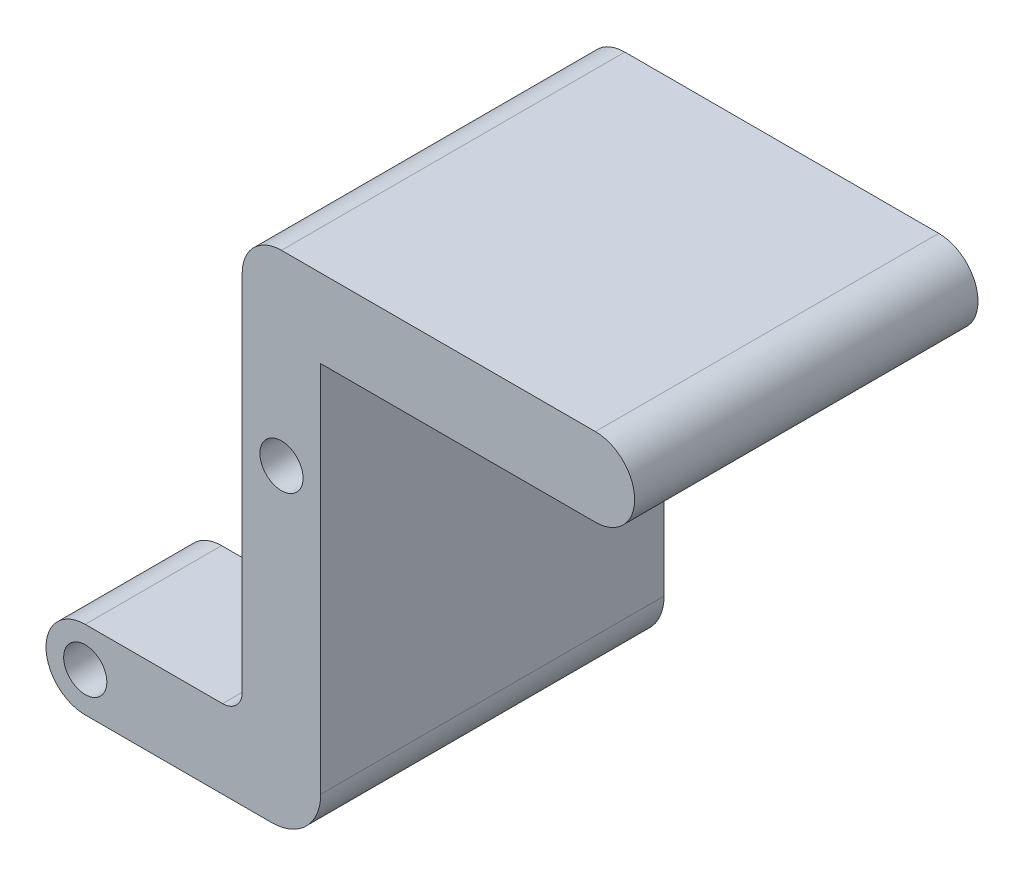
ISO-10303-21;
HEADER;
FILE_DESCRIPTION(('STEP AP214'),'2;1');
FILE_NAME('part.step','',(''),(''),'','','');
FILE_SCHEMA(('AUTOMOTIVE_DESIGN { 1 0 10303 214 1 1 1 1 }'));
ENDSEC;
DATA;
#1=APPLICATION_CONTEXT('core data for automotive mechanical design processes');
#2=APPLICATION_PROTOCOL_DEFINITION('international standard','automotive_design',2000,#1);
#3=PRODUCT_CONTEXT('',#1,'mechanical');
#4=PRODUCT('Part','Part','',(#3));
#5=PRODUCT_RELATED_PRODUCT_CATEGORY('part','',(#4));
#6=PRODUCT_DEFINITION_FORMATION('','',#4);
#7=PRODUCT_DEFINITION_CONTEXT('part definition',#1,'design');
#8=PRODUCT_DEFINITION('design','',#6,#7);
#9=PRODUCT_DEFINITION_SHAPE('','',#8);
#10=(LENGTH_UNIT() NAMED_UNIT(*) SI_UNIT(.MILLI.,.METRE.));
#11=(NAMED_UNIT(*) PLANE_ANGLE_UNIT() SI_UNIT($,.RADIAN.));
#12=(NAMED_UNIT(*) SI_UNIT($,.STERADIAN.) SOLID_ANGLE_UNIT());
#13=UNCERTAINTY_MEASURE_WITH_UNIT(LENGTH_MEASURE(1.E-05),#10,'distance_accuracy_value','');
#14=(GEOMETRIC_REPRESENTATION_CONTEXT(3) GLOBAL_UNCERTAINTY_ASSIGNED_CONTEXT((#13)) GLOBAL_UNIT_ASSIGNED_CONTEXT((#10,
#11,#12)) REPRESENTATION_CONTEXT('',''));
#15=CARTESIAN_POINT('',(0.,0.,0.));
#16=DIRECTION('',(0.,0.,1.));
#17=DIRECTION('',(1.,0.,0.));
#18=AXIS2_PLACEMENT_3D('',#15,#16,#17);
#19=CARTESIAN_POINT('',(-100.,0.,87.5));
#20=DIRECTION('',(0.,0.,-1.));
#21=DIRECTION('',(-1.,0.,0.));
#22=AXIS2_PLACEMENT_3D('',#19,#20,#21);
#23=CYLINDRICAL_SURFACE('',#22,20.);
#24=CARTESIAN_POINT('',(-100.,0.,-18.));
#25=DIRECTION('',(0.,0.,1.));
#26=DIRECTION('',(1.,0.,0.));
#27=AXIS2_PLACEMENT_3D('',#24,#25,#26);
#28=CIRCLE('',#27,20.);
#29=CARTESIAN_POINT('',(-100.,20.,-18.));
#30=VERTEX_POINT('',#29);
#31=CARTESIAN_POINT('',(-100.,-20.,-18.));
#32=VERTEX_POINT('',#31);
#33=EDGE_CURVE('E57',#30,#32,#28,.T.);
#34=ORIENTED_EDGE('',*,*,#33,.F.);
#35=DIRECTION('',(0.,0.,-1.));
#36=VECTOR('',#35,1.);
#37=CARTESIAN_POINT('',(-100.,20.,87.5));
#38=LINE('',#37,#36);
#39=CARTESIAN_POINT('',(-100.,20.,-87.5));
#40=VERTEX_POINT('',#39);
#41=EDGE_CURVE('E255',#30,#40,#38,.T.);
#42=ORIENTED_EDGE('',*,*,#41,.T.);
#43=CARTESIAN_POINT('',(-100.,0.,-87.5));
#44=DIRECTION('',(0.,0.,1.));
#45=DIRECTION('',(1.,0.,0.));
#46=AXIS2_PLACEMENT_3D('',#43,#44,#45);
#47=CIRCLE('',#46,20.);
#48=CARTESIAN_POINT('',(-100.,-20.,-87.5));
#49=VERTEX_POINT('',#48);
#50=EDGE_CURVE('E243',#40,#49,#47,.T.);
#51=ORIENTED_EDGE('',*,*,#50,.T.);
#52=DIRECTION('',(0.,0.,-1.));
#53=VECTOR('',#52,1.);
#54=CARTESIAN_POINT('',(-100.,-20.,87.5));
#55=LINE('',#54,#53);
#56=EDGE_CURVE('E240',#32,#49,#55,.T.);
#57=ORIENTED_EDGE('',*,*,#56,.F.);
#58=EDGE_LOOP('',(#34,#42,#51,#57));
#59=FACE_BOUND('',#58,.T.);
#60=ADVANCED_FACE('F40',(#59),#23,.T.);
#61=CARTESIAN_POINT('',(-100.,0.,-118.612698372208));
#62=DIRECTION('',(0.,0.,1.));
#63=DIRECTION('',(1.,0.,0.));
#64=AXIS2_PLACEMENT_3D('',#61,#62,#63);
#65=CYLINDRICAL_SURFACE('',#64,11.);
#66=CARTESIAN_POINT('',(-100.,0.,-87.5));
#67=DIRECTION('',(0.,0.,1.));
#68=DIRECTION('',(1.,0.,0.));
#69=AXIS2_PLACEMENT_3D('',#66,#67,#68);
#70=CIRCLE('',#69,11.);
#71=CARTESIAN_POINT('',(-89.,0.,-87.5));
#72=VERTEX_POINT('',#71);
#73=EDGE_CURVE('E220',#72,#72,#70,.F.);
#74=CARTESIAN_POINT('',(-100.,0.,-18.));
#75=DIRECTION('',(0.,0.,1.));
#76=DIRECTION('',(1.,0.,0.));
#77=AXIS2_PLACEMENT_3D('',#74,#75,#76);
#78=CIRCLE('',#77,11.);
#79=CARTESIAN_POINT('',(-89.,0.,-18.));
#80=VERTEX_POINT('',#79);
#81=EDGE_CURVE('E212',#80,#80,#78,.F.);
#82=CARTESIAN_POINT('',(-89.,0.,-87.5));
#83=CARTESIAN_POINT('',(-89.,0.,-86.7760416666667));
#84=CARTESIAN_POINT('',(-89.,0.,-86.0520833333333));
#85=CARTESIAN_POINT('',(-89.,0.,-84.6041666666667));
#86=CARTESIAN_POINT('',(-89.,0.,-83.8802083333333));
#87=CARTESIAN_POINT('',(-89.,0.,-82.4322916666667));
#88=CARTESIAN_POINT('',(-89.,0.,-81.7083333333333));
#89=CARTESIAN_POINT('',(-89.,0.,-80.2604166666667));
#90=CARTESIAN_POINT('',(-89.,0.,-79.5364583333333));
#91=CARTESIAN_POINT('',(-89.,0.,-78.0885416666667));
#92=CARTESIAN_POINT('',(-89.,0.,-77.3645833333333));
#93=CARTESIAN_POINT('',(-89.,0.,-75.9166666666667));
#94=CARTESIAN_POINT('',(-89.,0.,-75.1927083333333));
#95=CARTESIAN_POINT('',(-89.,0.,-73.7447916666667));
#96=CARTESIAN_POINT('',(-89.,0.,-73.0208333333333));
#97=CARTESIAN_POINT('',(-89.,0.,-71.5729166666667));
#98=CARTESIAN_POINT('',(-89.,0.,-70.8489583333333));
#99=CARTESIAN_POINT('',(-89.,0.,-69.4010416666667));
#100=CARTESIAN_POINT('',(-89.,0.,-68.6770833333333));
#101=CARTESIAN_POINT('',(-89.,0.,-67.2291666666667));
#102=CARTESIAN_POINT('',(-89.,0.,-66.5052083333333));
#103=CARTESIAN_POINT('',(-89.,0.,-65.0572916666667));
#104=CARTESIAN_POINT('',(-89.,0.,-64.3333333333333));
#105=CARTESIAN_POINT('',(-89.,0.,-62.8854166666667));
#106=CARTESIAN_POINT('',(-89.,0.,-62.1614583333333));
#107=CARTESIAN_POINT('',(-89.,0.,-60.7135416666667));
#108=CARTESIAN_POINT('',(-89.,0.,-59.9895833333333));
#109=CARTESIAN_POINT('',(-89.,0.,-58.5416666666667));
#110=CARTESIAN_POINT('',(-89.,0.,-57.8177083333333));
#111=CARTESIAN_POINT('',(-89.,0.,-56.3697916666667));
#112=CARTESIAN_POINT('',(-89.,0.,-55.6458333333333));
#113=CARTESIAN_POINT('',(-89.,0.,-54.1979166666667));
#114=CARTESIAN_POINT('',(-89.,0.,-53.4739583333333));
#115=CARTESIAN_POINT('',(-89.,0.,-52.0260416666667));
#116=CARTESIAN_POINT('',(-89.,0.,-51.3020833333333));
#117=CARTESIAN_POINT('',(-89.,0.,-49.8541666666667));
#118=CARTESIAN_POINT('',(-89.,0.,-49.1302083333333));
#119=CARTESIAN_POINT('',(-89.,0.,-47.6822916666667));
#120=CARTESIAN_POINT('',(-89.,0.,-46.9583333333333));
#121=CARTESIAN_POINT('',(-89.,0.,-45.5104166666667));
#122=CARTESIAN_POINT('',(-89.,0.,-44.7864583333333));
#123=CARTESIAN_POINT('',(-89.,0.,-43.3385416666667));
#124=CARTESIAN_POINT('',(-89.,0.,-42.6145833333333));
#125=CARTESIAN_POINT('',(-89.,0.,-41.1666666666667));
#126=CARTESIAN_POINT('',(-89.,0.,-40.4427083333333));
#127=CARTESIAN_POINT('',(-89.,0.,-38.9947916666667));
#128=CARTESIAN_POINT('',(-89.,0.,-38.2708333333333));
#129=CARTESIAN_POINT('',(-89.,0.,-36.8229166666667));
#130=CARTESIAN_POINT('',(-89.,0.,-36.0989583333333));
#131=CARTESIAN_POINT('',(-89.,0.,-34.6510416666667));
#132=CARTESIAN_POINT('',(-89.,0.,-33.9270833333333));
#133=CARTESIAN_POINT('',(-89.,0.,-32.4791666666667));
#134=CARTESIAN_POINT('',(-89.,0.,-31.7552083333333));
#135=CARTESIAN_POINT('',(-89.,0.,-30.3072916666667));
#136=CARTESIAN_POINT('',(-89.,0.,-29.5833333333333));
#137=CARTESIAN_POINT('',(-89.,0.,-28.1354166666667));
#138=CARTESIAN_POINT('',(-89.,0.,-27.4114583333333));
#139=CARTESIAN_POINT('',(-89.,0.,-25.9635416666667));
#140=CARTESIAN_POINT('',(-89.,0.,-25.2395833333333));
#141=CARTESIAN_POINT('',(-89.,0.,-23.7916666666667));
#142=CARTESIAN_POINT('',(-89.,0.,-23.0677083333333));
#143=CARTESIAN_POINT('',(-89.,0.,-21.6197916666667));
#144=CARTESIAN_POINT('',(-89.,0.,-20.8958333333333));
#145=CARTESIAN_POINT('',(-89.,0.,-19.4479166666667));
#146=CARTESIAN_POINT('',(-89.,0.,-18.7239583333333));
#147=CARTESIAN_POINT('',(-89.,0.,-18.));
#148=B_SPLINE_CURVE_WITH_KNOTS('',3,(#82,#83,#84,#85,#86,#87,#88,#89,#90,#91,#92,#93,#94,#95,
#96,#97,#98,#99,#100,#101,#102,#103,#104,#105,#106,#107,#108,#109,#110,#111,#112,#113,#114,#115,
#116,#117,#118,#119,#120,#121,#122,#123,#124,#125,#126,#127,#128,#129,#130,#131,#132,#133,#134,
#135,#136,#137,#138,#139,#140,#141,#142,#143,#144,#145,#146,#147),.UNSPECIFIED.,.F.,.F.,(4,2,2,
2,2,2,2,2,2,2,2,2,2,2,2,2,2,2,2,2,2,2,2,2,2,2,2,2,2,2,2,2,4),(0.,2.171875,4.34374999999999,
6.51562500000001,8.6875,10.859375,13.03125,15.203125,17.375,19.546875,21.71875,23.890625,
26.0625,28.234375,30.40625,32.578125,34.75,36.921875,39.09375,41.265625,43.4375,45.609375,
47.78125,49.953125,52.125,54.296875,56.46875,58.640625,60.8125,62.984375,65.15625,67.328125,
69.5),.UNSPECIFIED.);
#149=EDGE_CURVE('BSEAM278',#72,#80,#148,.T.);
#150=ORIENTED_EDGE('',*,*,#73,.T.);
#151=ORIENTED_EDGE('',*,*,#81,.F.);
#152=ORIENTED_EDGE('',*,*,#149,.T.);
#153=ORIENTED_EDGE('',*,*,#149,.F.);
#154=EDGE_LOOP('',(#150,#152,#151,#153));
#155=FACE_BOUND('',#154,.T.);
#156=ADVANCED_FACE('F278',(#155),#65,.F.);
#157=CARTESIAN_POINT('',(-20.,20.,87.5));
#158=DIRECTION('',(0.,-1.,0.));
#159=DIRECTION('',(1.,0.,0.));
#160=AXIS2_PLACEMENT_3D('',#157,#158,#159);
#161=PLANE('',#160);
#162=DIRECTION('',(0.,0.,-1.));
#163=VECTOR('',#162,1.);
#164=CARTESIAN_POINT('',(-80.,20.,18.));
#165=LINE('',#164,#163);
#166=CARTESIAN_POINT('',(-80.,20.,18.));
#167=VERTEX_POINT('',#166);
#168=CARTESIAN_POINT('',(-80.,20.,-18.));
#169=VERTEX_POINT('',#168);
#170=EDGE_CURVE('E207',#167,#169,#165,.T.);
#171=ORIENTED_EDGE('',*,*,#170,.F.);
#172=DIRECTION('',(-1.,0.,0.));
#173=VECTOR('',#172,1.);
#174=CARTESIAN_POINT('',(-120.,20.,18.));
#175=LINE('',#174,#173);
#176=CARTESIAN_POINT('',(-100.,20.,18.));
#177=VERTEX_POINT('',#176);
#178=EDGE_CURVE('E204',#167,#177,#175,.T.);
#179=ORIENTED_EDGE('',*,*,#178,.T.);
#180=CARTESIAN_POINT('',(-100.,20.,87.5));
#181=VERTEX_POINT('',#180);
#182=EDGE_CURVE('E256',#181,#177,#38,.T.);
#183=ORIENTED_EDGE('',*,*,#182,.F.);
#184=DIRECTION('',(-1.,0.,0.));
#185=VECTOR('',#184,1.);
#186=CARTESIAN_POINT('',(-20.,20.,87.5));
#187=LINE('',#186,#185);
#188=CARTESIAN_POINT('',(-30.,20.,87.5));
#189=VERTEX_POINT('',#188);
#190=EDGE_CURVE('E229',#189,#181,#187,.T.);
#191=ORIENTED_EDGE('',*,*,#190,.F.);
#192=DIRECTION('',(0.,0.,-1.));
#193=VECTOR('',#192,1.);
#194=CARTESIAN_POINT('',(-30.,20.,-87.5));
#195=LINE('',#194,#193);
#196=CARTESIAN_POINT('',(-30.,20.,-87.5));
#197=VERTEX_POINT('',#196);
#198=EDGE_CURVE('E259',#189,#197,#195,.T.);
#199=ORIENTED_EDGE('',*,*,#198,.T.);
#200=DIRECTION('',(-1.,0.,0.));
#201=VECTOR('',#200,1.);
#202=CARTESIAN_POINT('',(-20.,20.,-87.5));
#203=LINE('',#202,#201);
#204=EDGE_CURVE('E224',#197,#40,#203,.T.);
#205=ORIENTED_EDGE('',*,*,#204,.T.);
#206=ORIENTED_EDGE('',*,*,#41,.F.);
#207=DIRECTION('',(-1.,0.,0.));
#208=VECTOR('',#207,1.);
#209=CARTESIAN_POINT('',(-120.,20.,-18.));
#210=LINE('',#209,#208);
#211=EDGE_CURVE('E197',#169,#30,#210,.T.);
#212=ORIENTED_EDGE('',*,*,#211,.F.);
#213=EDGE_LOOP('',(#171,#179,#183,#191,#199,#205,#206,#212));
#214=FACE_BOUND('',#213,.T.);
#215=ADVANCED_FACE('F280',(#214),#161,.F.);
#216=ORIENTED_EDGE('',*,*,#182,.T.);
#217=CARTESIAN_POINT('',(-100.,0.,18.));
#218=DIRECTION('',(0.,0.,1.));
#219=DIRECTION('',(1.,0.,0.));
#220=AXIS2_PLACEMENT_3D('',#217,#218,#219);
#221=CIRCLE('',#220,20.);
#222=CARTESIAN_POINT('',(-100.,-20.,18.));
#223=VERTEX_POINT('',#222);
#224=EDGE_CURVE('E214',#177,#223,#221,.T.);
#225=ORIENTED_EDGE('',*,*,#224,.T.);
#226=CARTESIAN_POINT('',(-100.,-20.,87.5));
#227=VERTEX_POINT('',#226);
#228=EDGE_CURVE('E252',#227,#223,#55,.T.);
#229=ORIENTED_EDGE('',*,*,#228,.F.);
#230=CARTESIAN_POINT('',(-100.,0.,87.5));
#231=DIRECTION('',(0.,0.,1.));
#232=DIRECTION('',(1.,0.,0.));
#233=AXIS2_PLACEMENT_3D('',#230,#231,#232);
#234=CIRCLE('',#233,20.);
#235=EDGE_CURVE('E231',#181,#227,#234,.T.);
#236=ORIENTED_EDGE('',*,*,#235,.F.);
#237=EDGE_LOOP('',(#216,#225,#229,#236));
#238=FACE_BOUND('',#237,.T.);
#239=ADVANCED_FACE('F288',(#238),#23,.T.);
#240=CARTESIAN_POINT('',(20.,-20.,87.5));
#241=DIRECTION('',(0.,1.,0.));
#242=DIRECTION('',(-1.,0.,0.));
#243=AXIS2_PLACEMENT_3D('',#240,#241,#242);
#244=PLANE('',#243);
#245=ORIENTED_EDGE('',*,*,#228,.T.);
#246=DIRECTION('',(1.,0.,0.));
#247=VECTOR('',#246,1.);
#248=CARTESIAN_POINT('',(-120.,-20.,18.));
#249=LINE('',#248,#247);
#250=CARTESIAN_POINT('',(-80.,-20.,18.));
#251=VERTEX_POINT('',#250);
#252=EDGE_CURVE('E199',#223,#251,#249,.T.);
#253=ORIENTED_EDGE('',*,*,#252,.T.);
#254=DIRECTION('',(0.,0.,-1.));
#255=VECTOR('',#254,1.);
#256=CARTESIAN_POINT('',(-80.,-20.,18.));
#257=LINE('',#256,#255);
#258=CARTESIAN_POINT('',(-80.,-20.,-18.));
#259=VERTEX_POINT('',#258);
#260=EDGE_CURVE('E209',#251,#259,#257,.T.);
#261=ORIENTED_EDGE('',*,*,#260,.T.);
#262=DIRECTION('',(1.,0.,0.));
#263=VECTOR('',#262,1.);
#264=CARTESIAN_POINT('',(-120.,-20.,-18.));
#265=LINE('',#264,#263);
#266=EDGE_CURVE('E192',#32,#259,#265,.T.);
#267=ORIENTED_EDGE('',*,*,#266,.F.);
#268=ORIENTED_EDGE('',*,*,#56,.T.);
#269=DIRECTION('',(1.,0.,0.));
#270=VECTOR('',#269,1.);
#271=CARTESIAN_POINT('',(20.,-20.,-87.5));
#272=LINE('',#271,#270);
#273=CARTESIAN_POINT('',(-4.99999999999999,-20.,-87.5));
#274=VERTEX_POINT('',#273);
#275=EDGE_CURVE('E246',#49,#274,#272,.T.);
#276=ORIENTED_EDGE('',*,*,#275,.T.);
#277=DIRECTION('',(0.,0.,-1.));
#278=VECTOR('',#277,1.);
#279=CARTESIAN_POINT('',(-5.,-20.,87.5));
#280=LINE('',#279,#278);
#281=CARTESIAN_POINT('',(-4.99999999999999,-20.,87.5));
#282=VERTEX_POINT('',#281);
#283=EDGE_CURVE('E49',#274,#282,#280,.F.);
#284=ORIENTED_EDGE('',*,*,#283,.T.);
#285=DIRECTION('',(1.,0.,0.));
#286=VECTOR('',#285,1.);
#287=CARTESIAN_POINT('',(20.,-20.,87.5));
#288=LINE('',#287,#286);
#289=EDGE_CURVE('E234',#227,#282,#288,.T.);
#290=ORIENTED_EDGE('',*,*,#289,.F.);
#291=EDGE_LOOP('',(#245,#253,#261,#267,#268,#276,#284,#290));
#292=FACE_BOUND('',#291,.T.);
#293=ADVANCED_FACE('F329',(#292),#244,.F.);
#294=CARTESIAN_POINT('',(20.,-20.,87.5));
#295=DIRECTION('',(-1.,0.,0.));
#296=DIRECTION('',(0.,0.,1.));
#297=AXIS2_PLACEMENT_3D('',#294,#295,#296);
#298=PLANE('',#297);
#299=DIRECTION('',(0.,1.,0.));
#300=VECTOR('',#299,1.);
#301=CARTESIAN_POINT('',(20.,-20.,87.5));
#302=LINE('',#301,#300);
#303=CARTESIAN_POINT('',(20.,5.,87.5));
#304=VERTEX_POINT('',#303);
#305=CARTESIAN_POINT('',(20.,195.09,87.5));
#306=VERTEX_POINT('',#305);
#307=EDGE_CURVE('E155',#304,#306,#302,.T.);
#308=ORIENTED_EDGE('',*,*,#307,.F.);
#309=DIRECTION('',(0.,0.,-1.));
#310=VECTOR('',#309,1.);
#311=CARTESIAN_POINT('',(20.,5.,87.5));
#312=LINE('',#311,#310);
#313=CARTESIAN_POINT('',(20.,5.,-87.5));
#314=VERTEX_POINT('',#313);
#315=EDGE_CURVE('E268',#304,#314,#312,.T.);
#316=ORIENTED_EDGE('',*,*,#315,.T.);
#317=DIRECTION('',(0.,1.,0.));
#318=VECTOR('',#317,1.);
#319=CARTESIAN_POINT('',(20.,-20.,-87.5));
#320=LINE('',#319,#318);
#321=CARTESIAN_POINT('',(20.,195.09,-87.5));
#322=VERTEX_POINT('',#321);
#323=EDGE_CURVE('E248',#314,#322,#320,.T.);
#324=ORIENTED_EDGE('',*,*,#323,.T.);
#325=DIRECTION('',(0.,0.,-1.));
#326=VECTOR('',#325,1.);
#327=CARTESIAN_POINT('',(20.,195.09,308.954528289669));
#328=LINE('',#327,#326);
#329=EDGE_CURVE('E170',#306,#322,#328,.T.);
#330=ORIENTED_EDGE('',*,*,#329,.F.);
#331=EDGE_LOOP('',(#308,#316,#324,#330));
#332=FACE_BOUND('',#331,.T.);
#333=ADVANCED_FACE('F323',(#332),#298,.F.);
#334=CARTESIAN_POINT('',(-20.,20.,87.5));
#335=DIRECTION('',(1.,0.,0.));
#336=DIRECTION('',(0.,0.,-1.));
#337=AXIS2_PLACEMENT_3D('',#334,#335,#336);
#338=PLANE('',#337);
#339=DIRECTION('',(0.,-1.,0.));
#340=VECTOR('',#339,1.);
#341=CARTESIAN_POINT('',(-20.,20.,-87.5));
#342=LINE('',#341,#340);
#343=CARTESIAN_POINT('',(-20.,215.09,-87.5));
#344=VERTEX_POINT('',#343);
#345=CARTESIAN_POINT('',(-20.,30.,-87.5));
#346=VERTEX_POINT('',#345);
#347=EDGE_CURVE('E232',#344,#346,#342,.T.);
#348=ORIENTED_EDGE('',*,*,#347,.T.);
#349=DIRECTION('',(0.,0.,-1.));
#350=VECTOR('',#349,1.);
#351=CARTESIAN_POINT('',(-20.,30.,87.5));
#352=LINE('',#351,#350);
#353=CARTESIAN_POINT('',(-20.,30.,87.5));
#354=VERTEX_POINT('',#353);
#355=EDGE_CURVE('E262',#346,#354,#352,.F.);
#356=ORIENTED_EDGE('',*,*,#355,.T.);
#357=DIRECTION('',(0.,-1.,0.));
#358=VECTOR('',#357,1.);
#359=CARTESIAN_POINT('',(-20.,20.,87.5));
#360=LINE('',#359,#358);
#361=CARTESIAN_POINT('',(-20.,215.09,87.5));
#362=VERTEX_POINT('',#361);
#363=EDGE_CURVE('E237',#362,#354,#360,.T.);
#364=ORIENTED_EDGE('',*,*,#363,.F.);
#365=DIRECTION('',(0.,0.,-1.));
#366=VECTOR('',#365,1.);
#367=CARTESIAN_POINT('',(-20.,215.09,308.954528289669));
#368=LINE('',#367,#366);
#369=EDGE_CURVE('E187',#362,#344,#368,.T.);
#370=ORIENTED_EDGE('',*,*,#369,.T.);
#371=EDGE_LOOP('',(#348,#356,#364,#370));
#372=FACE_BOUND('',#371,.T.);
#373=ADVANCED_FACE('F313',(#372),#338,.F.);
#374=CARTESIAN_POINT('',(-100.,0.,87.5));
#375=DIRECTION('',(0.,0.,1.));
#376=DIRECTION('',(1.,0.,0.));
#377=AXIS2_PLACEMENT_3D('',#374,#375,#376);
#378=PLANE('',#377);
#379=CARTESIAN_POINT('',(-100.,0.,87.5));
#380=DIRECTION('',(0.,0.,1.));
#381=DIRECTION('',(1.,0.,0.));
#382=AXIS2_PLACEMENT_3D('',#379,#380,#381);
#383=CIRCLE('',#382,11.);
#384=CARTESIAN_POINT('',(-89.,0.,87.5));
#385=VERTEX_POINT('',#384);
#386=EDGE_CURVE('E217',#385,#385,#383,.T.);
#387=ORIENTED_EDGE('',*,*,#386,.F.);
#388=EDGE_LOOP('',(#387));
#389=FACE_BOUND('',#388,.T.);
#390=CARTESIAN_POINT('',(0.,140.,87.5));
#391=DIRECTION('',(0.,0.,1.));
#392=DIRECTION('',(1.,0.,0.));
#393=AXIS2_PLACEMENT_3D('',#390,#391,#392);
#394=CIRCLE('',#393,11.);
#395=CARTESIAN_POINT('',(11.,140.,87.5));
#396=VERTEX_POINT('',#395);
#397=EDGE_CURVE('E216',#396,#396,#394,.T.);
#398=ORIENTED_EDGE('',*,*,#397,.F.);
#399=EDGE_LOOP('',(#398));
#400=FACE_BOUND('',#399,.T.);
#401=ORIENTED_EDGE('',*,*,#289,.T.);
#402=CARTESIAN_POINT('',(-5.,5.,87.5));
#403=DIRECTION('',(0.,0.,1.));
#404=DIRECTION('',(1.,0.,0.));
#405=AXIS2_PLACEMENT_3D('',#402,#403,#404);
#406=CIRCLE('',#405,25.);
#407=EDGE_CURVE('E11',#282,#304,#406,.T.);
#408=ORIENTED_EDGE('',*,*,#407,.T.);
#409=ORIENTED_EDGE('',*,*,#307,.T.);
#410=DIRECTION('',(1.,0.,0.));
#411=VECTOR('',#410,1.);
#412=CARTESIAN_POINT('',(0.,195.09,87.5));
#413=LINE('',#412,#411);
#414=CARTESIAN_POINT('',(160.,195.09,87.5));
#415=VERTEX_POINT('',#414);
#416=EDGE_CURVE('E148',#306,#415,#413,.T.);
#417=ORIENTED_EDGE('',*,*,#416,.T.);
#418=CARTESIAN_POINT('',(160.,215.09,87.5));
#419=DIRECTION('',(0.,0.,1.));
#420=DIRECTION('',(1.,0.,0.));
#421=AXIS2_PLACEMENT_3D('',#418,#419,#420);
#422=CIRCLE('',#421,20.);
#423=CARTESIAN_POINT('',(160.,235.09,87.5));
#424=VERTEX_POINT('',#423);
#425=EDGE_CURVE('E152',#424,#415,#422,.F.);
#426=ORIENTED_EDGE('',*,*,#425,.F.);
#427=DIRECTION('',(1.,0.,0.));
#428=VECTOR('',#427,1.);
#429=CARTESIAN_POINT('',(0.,235.09,87.5));
#430=LINE('',#429,#428);
#431=CARTESIAN_POINT('',(0.,235.09,87.5));
#432=VERTEX_POINT('',#431);
#433=EDGE_CURVE('E180',#432,#424,#430,.T.);
#434=ORIENTED_EDGE('',*,*,#433,.F.);
#435=CARTESIAN_POINT('',(0.,215.09,87.5));
#436=DIRECTION('',(0.,0.,1.));
#437=DIRECTION('',(1.,0.,0.));
#438=AXIS2_PLACEMENT_3D('',#435,#436,#437);
#439=CIRCLE('',#438,20.);
#440=EDGE_CURVE('E160',#432,#362,#439,.T.);
#441=ORIENTED_EDGE('',*,*,#440,.T.);
#442=ORIENTED_EDGE('',*,*,#363,.T.);
#443=CARTESIAN_POINT('',(-30.,30.,87.5));
#444=DIRECTION('',(0.,0.,1.));
#445=DIRECTION('',(1.,0.,0.));
#446=AXIS2_PLACEMENT_3D('',#443,#444,#445);
#447=CIRCLE('',#446,10.);
#448=EDGE_CURVE('E266',#354,#189,#447,.F.);
#449=ORIENTED_EDGE('',*,*,#448,.T.);
#450=ORIENTED_EDGE('',*,*,#190,.T.);
#451=ORIENTED_EDGE('',*,*,#235,.T.);
#452=EDGE_LOOP('',(#401,#408,#409,#417,#426,#434,#441,#442,#449,#450,#451));
#453=FACE_BOUND('',#452,.T.);
#454=ADVANCED_FACE('F150',(#389,#400,#453),#378,.T.);
#455=CARTESIAN_POINT('',(-100.,0.,-87.5));
#456=DIRECTION('',(0.,0.,1.));
#457=DIRECTION('',(1.,0.,0.));
#458=AXIS2_PLACEMENT_3D('',#455,#456,#457);
#459=PLANE('',#458);
#460=ORIENTED_EDGE('',*,*,#73,.F.);
#461=EDGE_LOOP('',(#460));
#462=FACE_BOUND('',#461,.T.);
#463=CARTESIAN_POINT('',(0.,140.,-87.5));
#464=DIRECTION('',(0.,0.,1.));
#465=DIRECTION('',(1.,0.,0.));
#466=AXIS2_PLACEMENT_3D('',#463,#464,#465);
#467=CIRCLE('',#466,11.);
#468=CARTESIAN_POINT('',(11.,140.,-87.5));
#469=VERTEX_POINT('',#468);
#470=EDGE_CURVE('E221',#469,#469,#467,.F.);
#471=ORIENTED_EDGE('',*,*,#470,.F.);
#472=EDGE_LOOP('',(#471));
#473=FACE_BOUND('',#472,.T.);
#474=ORIENTED_EDGE('',*,*,#323,.F.);
#475=CARTESIAN_POINT('',(-5.,5.,-87.5));
#476=DIRECTION('',(0.,0.,1.));
#477=DIRECTION('',(1.,0.,0.));
#478=AXIS2_PLACEMENT_3D('',#475,#476,#477);
#479=CIRCLE('',#478,25.);
#480=EDGE_CURVE('E271',#314,#274,#479,.F.);
#481=ORIENTED_EDGE('',*,*,#480,.T.);
#482=ORIENTED_EDGE('',*,*,#275,.F.);
#483=ORIENTED_EDGE('',*,*,#50,.F.);
#484=ORIENTED_EDGE('',*,*,#204,.F.);
#485=CARTESIAN_POINT('',(-30.,30.,-87.5));
#486=DIRECTION('',(0.,0.,1.));
#487=DIRECTION('',(1.,0.,0.));
#488=AXIS2_PLACEMENT_3D('',#485,#486,#487);
#489=CIRCLE('',#488,10.);
#490=EDGE_CURVE('E264',#197,#346,#489,.T.);
#491=ORIENTED_EDGE('',*,*,#490,.T.);
#492=ORIENTED_EDGE('',*,*,#347,.F.);
#493=CARTESIAN_POINT('',(0.,215.09,-87.5));
#494=DIRECTION('',(0.,0.,-1.));
#495=DIRECTION('',(-1.,0.,0.));
#496=AXIS2_PLACEMENT_3D('',#493,#494,#495);
#497=CIRCLE('',#496,20.);
#498=CARTESIAN_POINT('',(0.,235.09,-87.5));
#499=VERTEX_POINT('',#498);
#500=EDGE_CURVE('E182',#499,#344,#497,.F.);
#501=ORIENTED_EDGE('',*,*,#500,.F.);
#502=DIRECTION('',(1.,0.,0.));
#503=VECTOR('',#502,1.);
#504=CARTESIAN_POINT('',(0.,235.09,-87.5));
#505=LINE('',#504,#503);
#506=CARTESIAN_POINT('',(160.,235.09,-87.5));
#507=VERTEX_POINT('',#506);
#508=EDGE_CURVE('E159',#499,#507,#505,.T.);
#509=ORIENTED_EDGE('',*,*,#508,.T.);
#510=CARTESIAN_POINT('',(160.,215.09,-87.5));
#511=DIRECTION('',(0.,0.,-1.));
#512=DIRECTION('',(-1.,0.,0.));
#513=AXIS2_PLACEMENT_3D('',#510,#511,#512);
#514=CIRCLE('',#513,20.);
#515=CARTESIAN_POINT('',(160.,195.09,-87.5));
#516=VERTEX_POINT('',#515);
#517=EDGE_CURVE('E175',#507,#516,#514,.T.);
#518=ORIENTED_EDGE('',*,*,#517,.T.);
#519=DIRECTION('',(1.,0.,0.));
#520=VECTOR('',#519,1.);
#521=CARTESIAN_POINT('',(0.,195.09,-87.5));
#522=LINE('',#521,#520);
#523=EDGE_CURVE('E166',#322,#516,#522,.T.);
#524=ORIENTED_EDGE('',*,*,#523,.F.);
#525=EDGE_LOOP('',(#474,#481,#482,#483,#484,#491,#492,#501,#509,#518,#524));
#526=FACE_BOUND('',#525,.T.);
#527=ADVANCED_FACE('F304',(#462,#473,#526),#459,.F.);
#528=CARTESIAN_POINT('',(0.,140.,-118.612698372208));
#529=DIRECTION('',(0.,0.,1.));
#530=DIRECTION('',(1.,0.,0.));
#531=AXIS2_PLACEMENT_3D('',#528,#529,#530);
#532=CYLINDRICAL_SURFACE('',#531,11.);
#533=CARTESIAN_POINT('',(11.,140.,-87.5));
#534=CARTESIAN_POINT('',(11.,140.,-85.6770833333333));
#535=CARTESIAN_POINT('',(11.,140.,-83.8541666666667));
#536=CARTESIAN_POINT('',(11.,140.,-80.2083333333333));
#537=CARTESIAN_POINT('',(11.,140.,-78.3854166666667));
#538=CARTESIAN_POINT('',(11.,140.,-74.7395833333333));
#539=CARTESIAN_POINT('',(11.,140.,-72.9166666666667));
#540=CARTESIAN_POINT('',(11.,140.,-69.2708333333334));
#541=CARTESIAN_POINT('',(11.,140.,-67.4479166666667));
#542=CARTESIAN_POINT('',(11.,140.,-63.8020833333333));
#543=CARTESIAN_POINT('',(11.,140.,-61.9791666666667));
#544=CARTESIAN_POINT('',(11.,140.,-58.3333333333333));
#545=CARTESIAN_POINT('',(11.,140.,-56.5104166666667));
#546=CARTESIAN_POINT('',(11.,140.,-52.8645833333333));
#547=CARTESIAN_POINT('',(11.,140.,-51.0416666666667));
#548=CARTESIAN_POINT('',(11.,140.,-47.3958333333333));
#549=CARTESIAN_POINT('',(11.,140.,-45.5729166666667));
#550=CARTESIAN_POINT('',(11.,140.,-41.9270833333334));
#551=CARTESIAN_POINT('',(11.,140.,-40.1041666666667));
#552=CARTESIAN_POINT('',(11.,140.,-36.4583333333333));
#553=CARTESIAN_POINT('',(11.,140.,-34.6354166666667));
#554=CARTESIAN_POINT('',(11.,140.,-30.9895833333333));
#555=CARTESIAN_POINT('',(11.,140.,-29.1666666666667));
#556=CARTESIAN_POINT('',(11.,140.,-25.5208333333333));
#557=CARTESIAN_POINT('',(11.,140.,-23.6979166666667));
#558=CARTESIAN_POINT('',(11.,140.,-20.0520833333334));
#559=CARTESIAN_POINT('',(11.,140.,-18.2291666666667));
#560=CARTESIAN_POINT('',(11.,140.,-14.5833333333334));
#561=CARTESIAN_POINT('',(11.,140.,-12.7604166666667));
#562=CARTESIAN_POINT('',(11.,140.,-9.11458333333336));
#563=CARTESIAN_POINT('',(11.,140.,-7.29166666666668));
#564=CARTESIAN_POINT('',(11.,140.,-3.64583333333334));
#565=CARTESIAN_POINT('',(11.,140.,-1.82291666666668));
#566=CARTESIAN_POINT('',(11.,140.,1.82291666666665));
#567=CARTESIAN_POINT('',(11.,140.,3.64583333333332));
#568=CARTESIAN_POINT('',(11.,140.,7.29166666666664));
#569=CARTESIAN_POINT('',(11.,140.,9.1145833333333));
#570=CARTESIAN_POINT('',(11.,140.,12.7604166666666));
#571=CARTESIAN_POINT('',(11.,140.,14.5833333333333));
#572=CARTESIAN_POINT('',(11.,140.,18.2291666666666));
#573=CARTESIAN_POINT('',(11.,140.,20.0520833333333));
#574=CARTESIAN_POINT('',(11.,140.,23.6979166666666));
#575=CARTESIAN_POINT('',(11.,140.,25.5208333333333));
#576=CARTESIAN_POINT('',(11.,140.,29.1666666666666));
#577=CARTESIAN_POINT('',(11.,140.,30.9895833333333));
#578=CARTESIAN_POINT('',(11.,140.,34.6354166666666));
#579=CARTESIAN_POINT('',(11.,140.,36.4583333333333));
#580=CARTESIAN_POINT('',(11.,140.,40.1041666666666));
#581=CARTESIAN_POINT('',(11.,140.,41.9270833333333));
#582=CARTESIAN_POINT('',(11.,140.,45.5729166666666));
#583=CARTESIAN_POINT('',(11.,140.,47.3958333333333));
#584=CARTESIAN_POINT('',(11.,140.,51.0416666666666));
#585=CARTESIAN_POINT('',(11.,140.,52.8645833333333));
#586=CARTESIAN_POINT('',(11.,140.,56.5104166666666));
#587=CARTESIAN_POINT('',(11.,140.,58.3333333333333));
#588=CARTESIAN_POINT('',(11.,140.,61.9791666666666));
#589=CARTESIAN_POINT('',(11.,140.,63.8020833333333));
#590=CARTESIAN_POINT('',(11.,140.,67.4479166666666));
#591=CARTESIAN_POINT('',(11.,140.,69.2708333333333));
#592=CARTESIAN_POINT('',(11.,140.,72.9166666666666));
#593=CARTESIAN_POINT('',(11.,140.,74.7395833333333));
#594=CARTESIAN_POINT('',(11.,140.,78.3854166666666));
#595=CARTESIAN_POINT('',(11.,140.,80.2083333333333));
#596=CARTESIAN_POINT('',(11.,140.,83.8541666666666));
#597=CARTESIAN_POINT('',(11.,140.,85.6770833333333));
#598=CARTESIAN_POINT('',(11.,140.,87.5));
#599=B_SPLINE_CURVE_WITH_KNOTS('',3,(#533,#534,#535,#536,#537,#538,#539,#540,#541,#542,#543,
#544,#545,#546,#547,#548,#549,#550,#551,#552,#553,#554,#555,#556,#557,#558,#559,#560,#561,#562,
#563,#564,#565,#566,#567,#568,#569,#570,#571,#572,#573,#574,#575,#576,#577,#578,#579,#580,#581,
#582,#583,#584,#585,#586,#587,#588,#589,#590,#591,#592,#593,#594,#595,#596,#597,#598),
.UNSPECIFIED.,.F.,.F.,(4,2,2,2,2,2,2,2,2,2,2,2,2,2,2,2,2,2,2,2,2,2,2,2,2,2,2,2,2,2,2,2,4),(0.,
5.46875000000001,10.9375,16.40625,21.875,27.34375,32.8125,38.28125,43.75,49.21875,54.6875,
60.15625,65.625,71.09375,76.5625,82.03125,87.5,92.96875,98.4375,103.90625,109.375,114.84375,
120.3125,125.78125,131.25,136.71875,142.1875,147.65625,153.125,158.59375,164.0625,169.53125,
175.),.UNSPECIFIED.);
#600=EDGE_CURVE('BSEAM297',#469,#396,#599,.T.);
#601=ORIENTED_EDGE('',*,*,#470,.T.);
#602=ORIENTED_EDGE('',*,*,#397,.T.);
#603=ORIENTED_EDGE('',*,*,#600,.T.);
#604=ORIENTED_EDGE('',*,*,#600,.F.);
#605=EDGE_LOOP('',(#601,#603,#602,#604));
#606=FACE_BOUND('',#605,.T.);
#607=ADVANCED_FACE('F297',(#606),#532,.F.);
#608=CARTESIAN_POINT('',(-100.,0.,18.));
#609=DIRECTION('',(0.,0.,1.));
#610=DIRECTION('',(1.,0.,0.));
#611=AXIS2_PLACEMENT_3D('',#608,#609,#610);
#612=CIRCLE('',#611,11.);
#613=CARTESIAN_POINT('',(-89.,0.,18.));
#614=VERTEX_POINT('',#613);
#615=EDGE_CURVE('E44',#614,#614,#612,.F.);
#616=CARTESIAN_POINT('',(-89.,0.,18.));
#617=CARTESIAN_POINT('',(-89.,0.,18.7239583333333));
#618=CARTESIAN_POINT('',(-89.,0.,19.4479166666666));
#619=CARTESIAN_POINT('',(-89.,0.,20.8958333333333));
#620=CARTESIAN_POINT('',(-89.,0.,21.6197916666666));
#621=CARTESIAN_POINT('',(-89.,0.,23.0677083333333));
#622=CARTESIAN_POINT('',(-89.,0.,23.7916666666666));
#623=CARTESIAN_POINT('',(-89.,0.,25.2395833333333));
#624=CARTESIAN_POINT('',(-89.,0.,25.9635416666666));
#625=CARTESIAN_POINT('',(-89.,0.,27.4114583333333));
#626=CARTESIAN_POINT('',(-89.,0.,28.1354166666666));
#627=CARTESIAN_POINT('',(-89.,0.,29.5833333333333));
#628=CARTESIAN_POINT('',(-89.,0.,30.3072916666666));
#629=CARTESIAN_POINT('',(-89.,0.,31.7552083333333));
#630=CARTESIAN_POINT('',(-89.,0.,32.4791666666666));
#631=CARTESIAN_POINT('',(-89.,0.,33.9270833333333));
#632=CARTESIAN_POINT('',(-89.,0.,34.6510416666666));
#633=CARTESIAN_POINT('',(-89.,0.,36.0989583333333));
#634=CARTESIAN_POINT('',(-89.,0.,36.8229166666666));
#635=CARTESIAN_POINT('',(-89.,0.,38.2708333333333));
#636=CARTESIAN_POINT('',(-89.,0.,38.9947916666666));
#637=CARTESIAN_POINT('',(-89.,0.,40.4427083333333));
#638=CARTESIAN_POINT('',(-89.,0.,41.1666666666666));
#639=CARTESIAN_POINT('',(-89.,0.,42.6145833333333));
#640=CARTESIAN_POINT('',(-89.,0.,43.3385416666666));
#641=CARTESIAN_POINT('',(-89.,0.,44.7864583333333));
#642=CARTESIAN_POINT('',(-89.,0.,45.5104166666666));
#643=CARTESIAN_POINT('',(-89.,0.,46.9583333333333));
#644=CARTESIAN_POINT('',(-89.,0.,47.6822916666666));
#645=CARTESIAN_POINT('',(-89.,0.,49.1302083333333));
#646=CARTESIAN_POINT('',(-89.,0.,49.8541666666666));
#647=CARTESIAN_POINT('',(-89.,0.,51.3020833333333));
#648=CARTESIAN_POINT('',(-89.,0.,52.0260416666666));
#649=CARTESIAN_POINT('',(-89.,0.,53.4739583333333));
#650=CARTESIAN_POINT('',(-89.,0.,54.1979166666666));
#651=CARTESIAN_POINT('',(-89.,0.,55.6458333333333));
#652=CARTESIAN_POINT('',(-89.,0.,56.3697916666666));
#653=CARTESIAN_POINT('',(-89.,0.,57.8177083333333));
#654=CARTESIAN_POINT('',(-89.,0.,58.5416666666666));
#655=CARTESIAN_POINT('',(-89.,0.,59.9895833333333));
#656=CARTESIAN_POINT('',(-89.,0.,60.7135416666666));
#657=CARTESIAN_POINT('',(-89.,0.,62.1614583333333));
#658=CARTESIAN_POINT('',(-89.,0.,62.8854166666666));
#659=CARTESIAN_POINT('',(-89.,0.,64.3333333333333));
#660=CARTESIAN_POINT('',(-89.,0.,65.0572916666666));
#661=CARTESIAN_POINT('',(-89.,0.,66.5052083333333));
#662=CARTESIAN_POINT('',(-89.,0.,67.2291666666666));
#663=CARTESIAN_POINT('',(-89.,0.,68.6770833333333));
#664=CARTESIAN_POINT('',(-89.,0.,69.4010416666666));
#665=CARTESIAN_POINT('',(-89.,0.,70.8489583333333));
#666=CARTESIAN_POINT('',(-89.,0.,71.5729166666666));
#667=CARTESIAN_POINT('',(-89.,0.,73.0208333333333));
#668=CARTESIAN_POINT('',(-89.,0.,73.7447916666666));
#669=CARTESIAN_POINT('',(-89.,0.,75.1927083333333));
#670=CARTESIAN_POINT('',(-89.,0.,75.9166666666666));
#671=CARTESIAN_POINT('',(-89.,0.,77.3645833333333));
#672=CARTESIAN_POINT('',(-89.,0.,78.0885416666666));
#673=CARTESIAN_POINT('',(-89.,0.,79.5364583333333));
#674=CARTESIAN_POINT('',(-89.,0.,80.2604166666666));
#675=CARTESIAN_POINT('',(-89.,0.,81.7083333333333));
#676=CARTESIAN_POINT('',(-89.,0.,82.4322916666666));
#677=CARTESIAN_POINT('',(-89.,0.,83.8802083333333));
#678=CARTESIAN_POINT('',(-89.,0.,84.6041666666666));
#679=CARTESIAN_POINT('',(-89.,0.,86.0520833333333));
#680=CARTESIAN_POINT('',(-89.,0.,86.7760416666666));
#681=CARTESIAN_POINT('',(-89.,0.,87.5));
#682=B_SPLINE_CURVE_WITH_KNOTS('',3,(#616,#617,#618,#619,#620,#621,#622,#623,#624,#625,#626,
#627,#628,#629,#630,#631,#632,#633,#634,#635,#636,#637,#638,#639,#640,#641,#642,#643,#644,#645,
#646,#647,#648,#649,#650,#651,#652,#653,#654,#655,#656,#657,#658,#659,#660,#661,#662,#663,#664,
#665,#666,#667,#668,#669,#670,#671,#672,#673,#674,#675,#676,#677,#678,#679,#680,#681),
.UNSPECIFIED.,.F.,.F.,(4,2,2,2,2,2,2,2,2,2,2,2,2,2,2,2,2,2,2,2,2,2,2,2,2,2,2,2,2,2,2,2,4),(0.,
2.17187499999999,4.34375000000001,6.515625,8.68750000000001,10.859375,13.03125,15.203125,17.375,
19.546875,21.71875,23.890625,26.0625,28.234375,30.40625,32.578125,34.75,36.921875,39.09375,
41.265625,43.4375,45.609375,47.78125,49.953125,52.125,54.296875,56.46875,58.640625,60.8125,
62.984375,65.15625,67.328125,69.5),.UNSPECIFIED.);
#683=EDGE_CURVE('BSEAM283',#614,#385,#682,.T.);
#684=ORIENTED_EDGE('',*,*,#615,.T.);
#685=ORIENTED_EDGE('',*,*,#386,.T.);
#686=ORIENTED_EDGE('',*,*,#683,.T.);
#687=ORIENTED_EDGE('',*,*,#683,.F.);
#688=EDGE_LOOP('',(#684,#686,#685,#687));
#689=FACE_BOUND('',#688,.T.);
#690=ADVANCED_FACE('F283',(#689),#65,.F.);
#691=CARTESIAN_POINT('',(-30.,30.,87.5));
#692=DIRECTION('',(0.,0.,1.));
#693=DIRECTION('',(1.,0.,0.));
#694=AXIS2_PLACEMENT_3D('',#691,#692,#693);
#695=CYLINDRICAL_SURFACE('',#694,10.);
#696=ORIENTED_EDGE('',*,*,#448,.F.);
#697=ORIENTED_EDGE('',*,*,#355,.F.);
#698=ORIENTED_EDGE('',*,*,#490,.F.);
#699=ORIENTED_EDGE('',*,*,#198,.F.);
#700=EDGE_LOOP('',(#696,#697,#698,#699));
#701=FACE_BOUND('',#700,.T.);
#702=ADVANCED_FACE('F296',(#701),#695,.F.);
#703=CARTESIAN_POINT('',(-5.,5.,87.5));
#704=DIRECTION('',(0.,0.,-1.));
#705=DIRECTION('',(-1.,0.,0.));
#706=AXIS2_PLACEMENT_3D('',#703,#704,#705);
#707=CYLINDRICAL_SURFACE('',#706,25.);
#708=ORIENTED_EDGE('',*,*,#407,.F.);
#709=ORIENTED_EDGE('',*,*,#283,.F.);
#710=ORIENTED_EDGE('',*,*,#480,.F.);
#711=ORIENTED_EDGE('',*,*,#315,.F.);
#712=EDGE_LOOP('',(#708,#709,#710,#711));
#713=FACE_BOUND('',#712,.T.);
#714=ADVANCED_FACE('F42',(#713),#707,.T.);
#715=CARTESIAN_POINT('',(0.,0.,18.));
#716=DIRECTION('',(0.,0.,1.));
#717=DIRECTION('',(1.,0.,0.));
#718=AXIS2_PLACEMENT_3D('',#715,#716,#717);
#719=PLANE('',#718);
#720=ORIENTED_EDGE('',*,*,#615,.F.);
#721=EDGE_LOOP('',(#720));
#722=FACE_BOUND('',#721,.T.);
#723=ORIENTED_EDGE('',*,*,#178,.F.);
#724=DIRECTION('',(0.,1.,0.));
#725=VECTOR('',#724,1.);
#726=CARTESIAN_POINT('',(-80.,20.,18.));
#727=LINE('',#726,#725);
#728=EDGE_CURVE('E202',#251,#167,#727,.T.);
#729=ORIENTED_EDGE('',*,*,#728,.F.);
#730=ORIENTED_EDGE('',*,*,#252,.F.);
#731=ORIENTED_EDGE('',*,*,#224,.F.);
#732=EDGE_LOOP('',(#723,#729,#730,#731));
#733=FACE_BOUND('',#732,.T.);
#734=ADVANCED_FACE('F347',(#722,#733),#719,.F.);
#735=CARTESIAN_POINT('',(0.,0.,-18.));
#736=DIRECTION('',(0.,0.,1.));
#737=DIRECTION('',(1.,0.,0.));
#738=AXIS2_PLACEMENT_3D('',#735,#736,#737);
#739=PLANE('',#738);
#740=ORIENTED_EDGE('',*,*,#81,.T.);
#741=EDGE_LOOP('',(#740));
#742=FACE_BOUND('',#741,.T.);
#743=ORIENTED_EDGE('',*,*,#33,.T.);
#744=ORIENTED_EDGE('',*,*,#266,.T.);
#745=DIRECTION('',(0.,1.,0.));
#746=VECTOR('',#745,1.);
#747=CARTESIAN_POINT('',(-80.,20.,-18.));
#748=LINE('',#747,#746);
#749=EDGE_CURVE('E194',#259,#169,#748,.T.);
#750=ORIENTED_EDGE('',*,*,#749,.T.);
#751=ORIENTED_EDGE('',*,*,#211,.T.);
#752=EDGE_LOOP('',(#743,#744,#750,#751));
#753=FACE_BOUND('',#752,.T.);
#754=ADVANCED_FACE('F276',(#742,#753),#739,.T.);
#755=CARTESIAN_POINT('',(-80.,20.,18.));
#756=DIRECTION('',(-1.,0.,0.));
#757=DIRECTION('',(0.,-1.,0.));
#758=AXIS2_PLACEMENT_3D('',#755,#756,#757);
#759=PLANE('',#758);
#760=ORIENTED_EDGE('',*,*,#260,.F.);
#761=ORIENTED_EDGE('',*,*,#728,.T.);
#762=ORIENTED_EDGE('',*,*,#170,.T.);
#763=ORIENTED_EDGE('',*,*,#749,.F.);
#764=EDGE_LOOP('',(#760,#761,#762,#763));
#765=FACE_BOUND('',#764,.T.);
#766=ADVANCED_FACE('F375',(#765),#759,.T.);
#767=CARTESIAN_POINT('',(160.,215.09,308.954528289669));
#768=DIRECTION('',(0.,0.,-1.));
#769=DIRECTION('',(-1.,0.,0.));
#770=AXIS2_PLACEMENT_3D('',#767,#768,#769);
#771=CYLINDRICAL_SURFACE('',#770,20.);
#772=DIRECTION('',(0.,0.,-1.));
#773=VECTOR('',#772,1.);
#774=CARTESIAN_POINT('',(160.,235.09,308.954528289669));
#775=LINE('',#774,#773);
#776=EDGE_CURVE('E174',#424,#507,#775,.T.);
#777=ORIENTED_EDGE('',*,*,#776,.F.);
#778=ORIENTED_EDGE('',*,*,#425,.T.);
#779=DIRECTION('',(0.,0.,-1.));
#780=VECTOR('',#779,1.);
#781=CARTESIAN_POINT('',(160.,195.09,308.954528289669));
#782=LINE('',#781,#780);
#783=EDGE_CURVE('E163',#415,#516,#782,.T.);
#784=ORIENTED_EDGE('',*,*,#783,.T.);
#785=ORIENTED_EDGE('',*,*,#517,.F.);
#786=EDGE_LOOP('',(#777,#778,#784,#785));
#787=FACE_BOUND('',#786,.T.);
#788=ADVANCED_FACE('F173',(#787),#771,.T.);
#789=CARTESIAN_POINT('',(0.,195.09,308.954528289669));
#790=DIRECTION('',(0.,1.,0.));
#791=DIRECTION('',(-1.,0.,0.));
#792=AXIS2_PLACEMENT_3D('',#789,#790,#791);
#793=PLANE('',#792);
#794=ORIENTED_EDGE('',*,*,#416,.F.);
#795=ORIENTED_EDGE('',*,*,#329,.T.);
#796=ORIENTED_EDGE('',*,*,#523,.T.);
#797=ORIENTED_EDGE('',*,*,#783,.F.);
#798=EDGE_LOOP('',(#794,#795,#796,#797));
#799=FACE_BOUND('',#798,.T.);
#800=ADVANCED_FACE('F164',(#799),#793,.F.);
#801=CARTESIAN_POINT('',(0.,215.09,308.954528289669));
#802=DIRECTION('',(0.,0.,-1.));
#803=DIRECTION('',(-1.,0.,0.));
#804=AXIS2_PLACEMENT_3D('',#801,#802,#803);
#805=CYLINDRICAL_SURFACE('',#804,20.);
#806=ORIENTED_EDGE('',*,*,#440,.F.);
#807=DIRECTION('',(0.,0.,-1.));
#808=VECTOR('',#807,1.);
#809=CARTESIAN_POINT('',(0.,235.09,308.954528289669));
#810=LINE('',#809,#808);
#811=EDGE_CURVE('E185',#432,#499,#810,.T.);
#812=ORIENTED_EDGE('',*,*,#811,.T.);
#813=ORIENTED_EDGE('',*,*,#500,.T.);
#814=ORIENTED_EDGE('',*,*,#369,.F.);
#815=EDGE_LOOP('',(#806,#812,#813,#814));
#816=FACE_BOUND('',#815,.T.);
#817=ADVANCED_FACE('F362',(#816),#805,.T.);
#818=CARTESIAN_POINT('',(0.,235.09,308.954528289669));
#819=DIRECTION('',(0.,1.,0.));
#820=DIRECTION('',(-1.,0.,0.));
#821=AXIS2_PLACEMENT_3D('',#818,#819,#820);
#822=PLANE('',#821);
#823=ORIENTED_EDGE('',*,*,#811,.F.);
#824=ORIENTED_EDGE('',*,*,#433,.T.);
#825=ORIENTED_EDGE('',*,*,#776,.T.);
#826=ORIENTED_EDGE('',*,*,#508,.F.);
#827=EDGE_LOOP('',(#823,#824,#825,#826));
#828=FACE_BOUND('',#827,.T.);
#829=ADVANCED_FACE('F366',(#828),#822,.T.);
#830=CLOSED_SHELL('',(#60,#156,#215,#239,#293,#333,#373,#454,#527,#607,#690,#702,#714,#734,#754,
#766,#788,#800,#817,#829));
#831=MANIFOLD_SOLID_BREP('B2',#830);
#832=ADVANCED_BREP_SHAPE_REPRESENTATION('',(#18,#831),#14);
#833=SHAPE_DEFINITION_REPRESENTATION(#9,#832);
ENDSEC;
END-ISO-10303-21;
